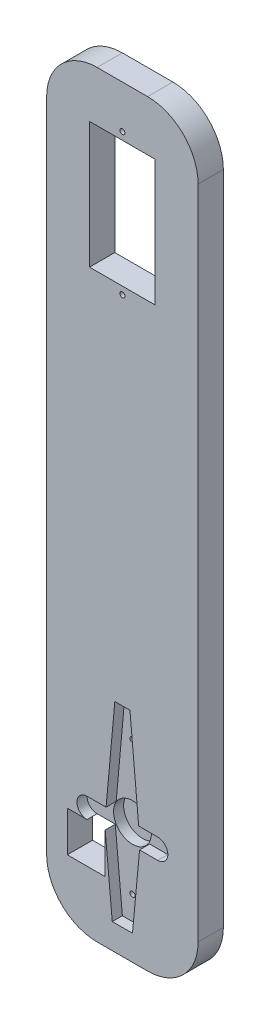
ISO-10303-21;
HEADER;
FILE_DESCRIPTION(('STEP AP214'),'2;1');
FILE_NAME('part.step','',(''),(''),'','','');
FILE_SCHEMA(('AUTOMOTIVE_DESIGN { 1 0 10303 214 1 1 1 1 }'));
ENDSEC;
DATA;
#1=APPLICATION_CONTEXT('core data for automotive mechanical design processes');
#2=APPLICATION_PROTOCOL_DEFINITION('international standard','automotive_design',2000,#1);
#3=PRODUCT_CONTEXT('',#1,'mechanical');
#4=PRODUCT('Part','Part','',(#3));
#5=PRODUCT_RELATED_PRODUCT_CATEGORY('part','',(#4));
#6=PRODUCT_DEFINITION_FORMATION('','',#4);
#7=PRODUCT_DEFINITION_CONTEXT('part definition',#1,'design');
#8=PRODUCT_DEFINITION('design','',#6,#7);
#9=PRODUCT_DEFINITION_SHAPE('','',#8);
#10=(LENGTH_UNIT() NAMED_UNIT(*) SI_UNIT(.MILLI.,.METRE.));
#11=(NAMED_UNIT(*) PLANE_ANGLE_UNIT() SI_UNIT($,.RADIAN.));
#12=(NAMED_UNIT(*) SI_UNIT($,.STERADIAN.) SOLID_ANGLE_UNIT());
#13=UNCERTAINTY_MEASURE_WITH_UNIT(LENGTH_MEASURE(1.E-05),#10,'distance_accuracy_value','');
#14=(GEOMETRIC_REPRESENTATION_CONTEXT(3) GLOBAL_UNCERTAINTY_ASSIGNED_CONTEXT((#13)) GLOBAL_UNIT_ASSIGNED_CONTEXT((#10,
#11,#12)) REPRESENTATION_CONTEXT('',''));
#15=CARTESIAN_POINT('',(0.,0.,0.));
#16=DIRECTION('',(0.,0.,1.));
#17=DIRECTION('',(1.,0.,0.));
#18=AXIS2_PLACEMENT_3D('',#15,#16,#17);
#19=CARTESIAN_POINT('',(0.,0.,5.));
#20=DIRECTION('',(0.,0.,-1.));
#21=DIRECTION('',(-1.,0.,0.));
#22=AXIS2_PLACEMENT_3D('',#19,#20,#21);
#23=PLANE('',#22);
#24=DIRECTION('',(1.,0.,0.));
#25=VECTOR('',#24,1.);
#26=CARTESIAN_POINT('',(0.,0.,5.));
#27=LINE('',#26,#25);
#28=CARTESIAN_POINT('',(10.,0.,5.));
#29=VERTEX_POINT('',#28);
#30=CARTESIAN_POINT('',(20.,0.,5.));
#31=VERTEX_POINT('',#30);
#32=EDGE_CURVE('E410',#29,#31,#27,.T.);
#33=ORIENTED_EDGE('',*,*,#32,.T.);
#34=CARTESIAN_POINT('',(20.,10.,5.));
#35=DIRECTION('',(0.,0.,-1.));
#36=DIRECTION('',(-1.,0.,0.));
#37=AXIS2_PLACEMENT_3D('',#34,#35,#36);
#38=CIRCLE('',#37,10.);
#39=CARTESIAN_POINT('',(30.,10.,5.));
#40=VERTEX_POINT('',#39);
#41=EDGE_CURVE('E454',#31,#40,#38,.F.);
#42=ORIENTED_EDGE('',*,*,#41,.T.);
#43=DIRECTION('',(0.,1.,0.));
#44=VECTOR('',#43,1.);
#45=CARTESIAN_POINT('',(30.,0.,5.));
#46=LINE('',#45,#44);
#47=CARTESIAN_POINT('',(30.,140.,5.));
#48=VERTEX_POINT('',#47);
#49=EDGE_CURVE('E414',#40,#48,#46,.T.);
#50=ORIENTED_EDGE('',*,*,#49,.T.);
#51=CARTESIAN_POINT('',(20.,140.,5.));
#52=DIRECTION('',(0.,0.,-1.));
#53=DIRECTION('',(-1.,0.,0.));
#54=AXIS2_PLACEMENT_3D('',#51,#52,#53);
#55=CIRCLE('',#54,10.);
#56=CARTESIAN_POINT('',(20.,150.,5.));
#57=VERTEX_POINT('',#56);
#58=EDGE_CURVE('E450',#48,#57,#55,.F.);
#59=ORIENTED_EDGE('',*,*,#58,.T.);
#60=DIRECTION('',(-1.,0.,0.));
#61=VECTOR('',#60,1.);
#62=CARTESIAN_POINT('',(0.,150.,5.));
#63=LINE('',#62,#61);
#64=CARTESIAN_POINT('',(10.,150.,5.));
#65=VERTEX_POINT('',#64);
#66=EDGE_CURVE('E417',#57,#65,#63,.T.);
#67=ORIENTED_EDGE('',*,*,#66,.T.);
#68=CARTESIAN_POINT('',(10.,140.,5.));
#69=DIRECTION('',(0.,0.,-1.));
#70=DIRECTION('',(-1.,0.,0.));
#71=AXIS2_PLACEMENT_3D('',#68,#69,#70);
#72=CIRCLE('',#71,10.);
#73=CARTESIAN_POINT('',(0.,140.,5.));
#74=VERTEX_POINT('',#73);
#75=EDGE_CURVE('E448',#65,#74,#72,.F.);
#76=ORIENTED_EDGE('',*,*,#75,.T.);
#77=DIRECTION('',(0.,-1.,0.));
#78=VECTOR('',#77,1.);
#79=CARTESIAN_POINT('',(0.,0.,5.));
#80=LINE('',#79,#78);
#81=CARTESIAN_POINT('',(0.,10.,5.));
#82=VERTEX_POINT('',#81);
#83=EDGE_CURVE('E407',#74,#82,#80,.T.);
#84=ORIENTED_EDGE('',*,*,#83,.T.);
#85=CARTESIAN_POINT('',(10.,10.,5.));
#86=DIRECTION('',(0.,0.,-1.));
#87=DIRECTION('',(-1.,0.,0.));
#88=AXIS2_PLACEMENT_3D('',#85,#86,#87);
#89=CIRCLE('',#88,10.);
#90=EDGE_CURVE('E452',#82,#29,#89,.F.);
#91=ORIENTED_EDGE('',*,*,#90,.T.);
#92=EDGE_LOOP('',(#33,#42,#50,#59,#67,#76,#84,#91));
#93=FACE_BOUND('',#92,.T.);
#94=DIRECTION('',(1.,0.,0.));
#95=VECTOR('',#94,1.);
#96=CARTESIAN_POINT('',(8.5,115.,5.));
#97=LINE('',#96,#95);
#98=CARTESIAN_POINT('',(8.5,115.,5.));
#99=VERTEX_POINT('',#98);
#100=CARTESIAN_POINT('',(21.5,115.,5.));
#101=VERTEX_POINT('',#100);
#102=EDGE_CURVE('E390',#99,#101,#97,.T.);
#103=ORIENTED_EDGE('',*,*,#102,.F.);
#104=DIRECTION('',(0.,-1.,0.));
#105=VECTOR('',#104,1.);
#106=CARTESIAN_POINT('',(8.5,140.,5.));
#107=LINE('',#106,#105);
#108=CARTESIAN_POINT('',(8.5,140.,5.));
#109=VERTEX_POINT('',#108);
#110=EDGE_CURVE('E366',#109,#99,#107,.T.);
#111=ORIENTED_EDGE('',*,*,#110,.F.);
#112=DIRECTION('',(-1.,0.,0.));
#113=VECTOR('',#112,1.);
#114=CARTESIAN_POINT('',(8.5,140.,5.));
#115=LINE('',#114,#113);
#116=CARTESIAN_POINT('',(21.5,140.,5.));
#117=VERTEX_POINT('',#116);
#118=EDGE_CURVE('E379',#117,#109,#115,.T.);
#119=ORIENTED_EDGE('',*,*,#118,.F.);
#120=DIRECTION('',(0.,1.,0.));
#121=VECTOR('',#120,1.);
#122=CARTESIAN_POINT('',(21.5,140.,5.));
#123=LINE('',#122,#121);
#124=EDGE_CURVE('E393',#101,#117,#123,.T.);
#125=ORIENTED_EDGE('',*,*,#124,.F.);
#126=EDGE_LOOP('',(#103,#111,#119,#125));
#127=FACE_BOUND('',#126,.T.);
#128=CARTESIAN_POINT('',(15.,113.5,5.));
#129=DIRECTION('',(0.,0.,1.));
#130=DIRECTION('',(-1.,0.,0.));
#131=AXIS2_PLACEMENT_3D('',#128,#129,#130);
#132=CIRCLE('',#131,0.500000000000001);
#133=CARTESIAN_POINT('',(14.5,113.5,5.));
#134=VERTEX_POINT('',#133);
#135=EDGE_CURVE('E342',#134,#134,#132,.T.);
#136=ORIENTED_EDGE('',*,*,#135,.F.);
#137=EDGE_LOOP('',(#136));
#138=FACE_BOUND('',#137,.T.);
#139=CARTESIAN_POINT('',(15.,141.5,5.));
#140=DIRECTION('',(0.,0.,1.));
#141=DIRECTION('',(1.,0.,0.));
#142=AXIS2_PLACEMENT_3D('',#139,#140,#141);
#143=CIRCLE('',#142,0.500000000000001);
#144=CARTESIAN_POINT('',(15.5,141.5,5.));
#145=VERTEX_POINT('',#144);
#146=EDGE_CURVE('E367',#145,#145,#143,.T.);
#147=ORIENTED_EDGE('',*,*,#146,.F.);
#148=EDGE_LOOP('',(#147));
#149=FACE_BOUND('',#148,.T.);
#150=DIRECTION('',(0.0933407086930581,-0.995634226059288,0.));
#151=VECTOR('',#150,1.);
#152=CARTESIAN_POINT('',(13.351403678606,1.25169409486931,5.));
#153=LINE('',#152,#151);
#154=CARTESIAN_POINT('',(11.59375,20.,5.));
#155=VERTEX_POINT('',#154);
#156=CARTESIAN_POINT('',(13.,5.,5.));
#157=VERTEX_POINT('',#156);
#158=EDGE_CURVE('E326',#155,#157,#153,.T.);
#159=ORIENTED_EDGE('',*,*,#158,.F.);
#160=DIRECTION('',(0.,1.,0.));
#161=VECTOR('',#160,1.);
#162=CARTESIAN_POINT('',(11.59375,20.,5.));
#163=LINE('',#162,#161);
#164=CARTESIAN_POINT('',(11.59375,12.,5.));
#165=VERTEX_POINT('',#164);
#166=EDGE_CURVE('E246',#165,#155,#163,.T.);
#167=ORIENTED_EDGE('',*,*,#166,.F.);
#168=DIRECTION('',(1.,0.,0.));
#169=VECTOR('',#168,1.);
#170=CARTESIAN_POINT('',(11.59375,12.,5.));
#171=LINE('',#170,#169);
#172=CARTESIAN_POINT('',(4.09375,12.,5.));
#173=VERTEX_POINT('',#172);
#174=EDGE_CURVE('E238',#173,#165,#171,.T.);
#175=ORIENTED_EDGE('',*,*,#174,.F.);
#176=DIRECTION('',(0.,-1.,0.));
#177=VECTOR('',#176,1.);
#178=CARTESIAN_POINT('',(4.09375,20.,5.));
#179=LINE('',#178,#177);
#180=CARTESIAN_POINT('',(4.09375,20.,5.));
#181=VERTEX_POINT('',#180);
#182=EDGE_CURVE('E241',#181,#173,#179,.T.);
#183=ORIENTED_EDGE('',*,*,#182,.F.);
#184=DIRECTION('',(-1.,0.,0.));
#185=VECTOR('',#184,1.);
#186=CARTESIAN_POINT('',(11.59375,20.,5.));
#187=LINE('',#186,#185);
#188=CARTESIAN_POINT('',(8.,20.,5.));
#189=VERTEX_POINT('',#188);
#190=EDGE_CURVE('E248',#189,#181,#187,.T.);
#191=ORIENTED_EDGE('',*,*,#190,.F.);
#192=CARTESIAN_POINT('',(8.,22.,5.));
#193=DIRECTION('',(0.,0.,1.));
#194=DIRECTION('',(1.,0.,0.));
#195=AXIS2_PLACEMENT_3D('',#192,#193,#194);
#196=CIRCLE('',#195,2.);
#197=CARTESIAN_POINT('',(8.,24.,5.));
#198=VERTEX_POINT('',#197);
#199=EDGE_CURVE('E323',#198,#189,#196,.T.);
#200=ORIENTED_EDGE('',*,*,#199,.F.);
#201=DIRECTION('',(1.,0.,0.));
#202=VECTOR('',#201,1.);
#203=CARTESIAN_POINT('',(0.,24.,5.));
#204=LINE('',#203,#202);
#205=CARTESIAN_POINT('',(11.7727272727273,24.,5.));
#206=VERTEX_POINT('',#205);
#207=EDGE_CURVE('E320',#198,#206,#204,.T.);
#208=ORIENTED_EDGE('',*,*,#207,.T.);
#209=DIRECTION('',(-0.0905357460425186,-0.995893206467704,0.));
#210=VECTOR('',#209,1.);
#211=CARTESIAN_POINT('',(9.51229508196721,-0.864754098360656,5.));
#212=LINE('',#211,#210);
#213=CARTESIAN_POINT('',(13.5,43.,5.));
#214=VERTEX_POINT('',#213);
#215=EDGE_CURVE('E317',#214,#206,#212,.T.);
#216=ORIENTED_EDGE('',*,*,#215,.F.);
#217=DIRECTION('',(1.,0.,0.));
#218=VECTOR('',#217,1.);
#219=CARTESIAN_POINT('',(0.,43.,5.));
#220=LINE('',#219,#218);
#221=CARTESIAN_POINT('',(16.5,43.,5.));
#222=VERTEX_POINT('',#221);
#223=EDGE_CURVE('E314',#214,#222,#220,.T.);
#224=ORIENTED_EDGE('',*,*,#223,.T.);
#225=DIRECTION('',(-0.0905357460425185,0.995893206467704,0.));
#226=VECTOR('',#225,1.);
#227=CARTESIAN_POINT('',(20.2418032786885,1.84016393442623,5.));
#228=LINE('',#227,#226);
#229=CARTESIAN_POINT('',(18.2272727272727,24.,5.));
#230=VERTEX_POINT('',#229);
#231=EDGE_CURVE('E311',#230,#222,#228,.T.);
#232=ORIENTED_EDGE('',*,*,#231,.F.);
#233=DIRECTION('',(1.,0.,0.));
#234=VECTOR('',#233,1.);
#235=CARTESIAN_POINT('',(0.,24.,5.));
#236=LINE('',#235,#234);
#237=CARTESIAN_POINT('',(22.,24.,5.));
#238=VERTEX_POINT('',#237);
#239=EDGE_CURVE('E56',#230,#238,#236,.T.);
#240=ORIENTED_EDGE('',*,*,#239,.T.);
#241=CARTESIAN_POINT('',(22.,22.,5.));
#242=DIRECTION('',(0.,0.,1.));
#243=DIRECTION('',(1.,0.,0.));
#244=AXIS2_PLACEMENT_3D('',#241,#242,#243);
#245=CIRCLE('',#244,2.);
#246=CARTESIAN_POINT('',(22.,20.,5.));
#247=VERTEX_POINT('',#246);
#248=EDGE_CURVE('E279',#238,#247,#245,.F.);
#249=ORIENTED_EDGE('',*,*,#248,.T.);
#250=DIRECTION('',(1.,0.,0.));
#251=VECTOR('',#250,1.);
#252=CARTESIAN_POINT('',(0.,20.,5.));
#253=LINE('',#252,#251);
#254=CARTESIAN_POINT('',(18.40625,20.,5.));
#255=VERTEX_POINT('',#254);
#256=EDGE_CURVE('E335',#255,#247,#253,.T.);
#257=ORIENTED_EDGE('',*,*,#256,.F.);
#258=DIRECTION('',(0.0933407086930581,0.995634226059288,0.));
#259=VECTOR('',#258,1.);
#260=CARTESIAN_POINT('',(16.3872216844143,-1.53630203291384,5.));
#261=LINE('',#260,#259);
#262=CARTESIAN_POINT('',(17.,5.,5.));
#263=VERTEX_POINT('',#262);
#264=EDGE_CURVE('E332',#263,#255,#261,.T.);
#265=ORIENTED_EDGE('',*,*,#264,.F.);
#266=DIRECTION('',(1.,0.,0.));
#267=VECTOR('',#266,1.);
#268=CARTESIAN_POINT('',(0.,5.,5.));
#269=LINE('',#268,#267);
#270=EDGE_CURVE('E329',#157,#263,#269,.T.);
#271=ORIENTED_EDGE('',*,*,#270,.F.);
#272=EDGE_LOOP('',(#159,#167,#175,#183,#191,#200,#208,#216,#224,#232,#240,#249,#257,#265,#271));
#273=FACE_BOUND('',#272,.T.);
#274=ADVANCED_FACE('F33',(#93,#127,#138,#149,#273),#23,.F.);
#275=CARTESIAN_POINT('',(0.,0.,5.));
#276=DIRECTION('',(1.,0.,0.));
#277=DIRECTION('',(0.,0.,-1.));
#278=AXIS2_PLACEMENT_3D('',#275,#276,#277);
#279=PLANE('',#278);
#280=DIRECTION('',(0.,-1.,0.));
#281=VECTOR('',#280,1.);
#282=CARTESIAN_POINT('',(0.,0.,0.));
#283=LINE('',#282,#281);
#284=CARTESIAN_POINT('',(0.,140.,0.));
#285=VERTEX_POINT('',#284);
#286=CARTESIAN_POINT('',(0.,10.,0.));
#287=VERTEX_POINT('',#286);
#288=EDGE_CURVE('E400',#285,#287,#283,.T.);
#289=ORIENTED_EDGE('',*,*,#288,.T.);
#290=DIRECTION('',(0.,0.,-1.));
#291=VECTOR('',#290,1.);
#292=CARTESIAN_POINT('',(0.,10.,5.));
#293=LINE('',#292,#291);
#294=EDGE_CURVE('E459',#287,#82,#293,.F.);
#295=ORIENTED_EDGE('',*,*,#294,.T.);
#296=ORIENTED_EDGE('',*,*,#83,.F.);
#297=DIRECTION('',(0.,0.,-1.));
#298=VECTOR('',#297,1.);
#299=CARTESIAN_POINT('',(0.,140.,5.));
#300=LINE('',#299,#298);
#301=EDGE_CURVE('E456',#74,#285,#300,.T.);
#302=ORIENTED_EDGE('',*,*,#301,.T.);
#303=EDGE_LOOP('',(#289,#295,#296,#302));
#304=FACE_BOUND('',#303,.T.);
#305=ADVANCED_FACE('F475',(#304),#279,.F.);
#306=CARTESIAN_POINT('',(0.,0.,5.));
#307=DIRECTION('',(0.,1.,0.));
#308=DIRECTION('',(0.,0.,1.));
#309=AXIS2_PLACEMENT_3D('',#306,#307,#308);
#310=PLANE('',#309);
#311=DIRECTION('',(1.,0.,0.));
#312=VECTOR('',#311,1.);
#313=CARTESIAN_POINT('',(0.,0.,0.));
#314=LINE('',#313,#312);
#315=CARTESIAN_POINT('',(10.,0.,0.));
#316=VERTEX_POINT('',#315);
#317=CARTESIAN_POINT('',(20.,0.,0.));
#318=VERTEX_POINT('',#317);
#319=EDGE_CURVE('E423',#316,#318,#314,.T.);
#320=ORIENTED_EDGE('',*,*,#319,.T.);
#321=DIRECTION('',(0.,0.,-1.));
#322=VECTOR('',#321,1.);
#323=CARTESIAN_POINT('',(20.,0.,5.));
#324=LINE('',#323,#322);
#325=EDGE_CURVE('E446',#318,#31,#324,.F.);
#326=ORIENTED_EDGE('',*,*,#325,.T.);
#327=ORIENTED_EDGE('',*,*,#32,.F.);
#328=DIRECTION('',(0.,0.,-1.));
#329=VECTOR('',#328,1.);
#330=CARTESIAN_POINT('',(10.,0.,5.));
#331=LINE('',#330,#329);
#332=EDGE_CURVE('E443',#29,#316,#331,.T.);
#333=ORIENTED_EDGE('',*,*,#332,.T.);
#334=EDGE_LOOP('',(#320,#326,#327,#333));
#335=FACE_BOUND('',#334,.T.);
#336=ADVANCED_FACE('F486',(#335),#310,.F.);
#337=CARTESIAN_POINT('',(30.,0.,5.));
#338=DIRECTION('',(-1.,0.,0.));
#339=DIRECTION('',(0.,0.,1.));
#340=AXIS2_PLACEMENT_3D('',#337,#338,#339);
#341=PLANE('',#340);
#342=ORIENTED_EDGE('',*,*,#49,.F.);
#343=DIRECTION('',(0.,0.,-1.));
#344=VECTOR('',#343,1.);
#345=CARTESIAN_POINT('',(30.,10.,5.));
#346=LINE('',#345,#344);
#347=CARTESIAN_POINT('',(30.,10.,0.));
#348=VERTEX_POINT('',#347);
#349=EDGE_CURVE('E432',#40,#348,#346,.T.);
#350=ORIENTED_EDGE('',*,*,#349,.T.);
#351=DIRECTION('',(0.,1.,0.));
#352=VECTOR('',#351,1.);
#353=CARTESIAN_POINT('',(30.,0.,0.));
#354=LINE('',#353,#352);
#355=CARTESIAN_POINT('',(30.,140.,0.));
#356=VERTEX_POINT('',#355);
#357=EDGE_CURVE('E426',#348,#356,#354,.T.);
#358=ORIENTED_EDGE('',*,*,#357,.T.);
#359=DIRECTION('',(0.,0.,-1.));
#360=VECTOR('',#359,1.);
#361=CARTESIAN_POINT('',(30.,140.,5.));
#362=LINE('',#361,#360);
#363=EDGE_CURVE('E420',#356,#48,#362,.F.);
#364=ORIENTED_EDGE('',*,*,#363,.T.);
#365=EDGE_LOOP('',(#342,#350,#358,#364));
#366=FACE_BOUND('',#365,.T.);
#367=ADVANCED_FACE('F494',(#366),#341,.F.);
#368=CARTESIAN_POINT('',(0.,150.,5.));
#369=DIRECTION('',(0.,-1.,0.));
#370=DIRECTION('',(0.,0.,-1.));
#371=AXIS2_PLACEMENT_3D('',#368,#369,#370);
#372=PLANE('',#371);
#373=ORIENTED_EDGE('',*,*,#66,.F.);
#374=DIRECTION('',(0.,0.,-1.));
#375=VECTOR('',#374,1.);
#376=CARTESIAN_POINT('',(20.,150.,5.));
#377=LINE('',#376,#375);
#378=CARTESIAN_POINT('',(20.,150.,0.));
#379=VERTEX_POINT('',#378);
#380=EDGE_CURVE('E11',#57,#379,#377,.T.);
#381=ORIENTED_EDGE('',*,*,#380,.T.);
#382=DIRECTION('',(-1.,0.,0.));
#383=VECTOR('',#382,1.);
#384=CARTESIAN_POINT('',(0.,150.,0.));
#385=LINE('',#384,#383);
#386=CARTESIAN_POINT('',(10.,150.,0.));
#387=VERTEX_POINT('',#386);
#388=EDGE_CURVE('E411',#379,#387,#385,.T.);
#389=ORIENTED_EDGE('',*,*,#388,.T.);
#390=DIRECTION('',(0.,0.,-1.));
#391=VECTOR('',#390,1.);
#392=CARTESIAN_POINT('',(10.,150.,5.));
#393=LINE('',#392,#391);
#394=EDGE_CURVE('E41',#387,#65,#393,.F.);
#395=ORIENTED_EDGE('',*,*,#394,.T.);
#396=EDGE_LOOP('',(#373,#381,#389,#395));
#397=FACE_BOUND('',#396,.T.);
#398=ADVANCED_FACE('F463',(#397),#372,.F.);
#399=CARTESIAN_POINT('',(0.,0.,0.));
#400=DIRECTION('',(0.,0.,-1.));
#401=DIRECTION('',(-1.,0.,0.));
#402=AXIS2_PLACEMENT_3D('',#399,#400,#401);
#403=PLANE('',#402);
#404=DIRECTION('',(0.,1.,0.));
#405=VECTOR('',#404,1.);
#406=CARTESIAN_POINT('',(11.59375,20.,0.));
#407=LINE('',#406,#405);
#408=CARTESIAN_POINT('',(11.59375,12.,0.));
#409=VERTEX_POINT('',#408);
#410=CARTESIAN_POINT('',(11.59375,20.,0.));
#411=VERTEX_POINT('',#410);
#412=EDGE_CURVE('E221',#409,#411,#407,.T.);
#413=ORIENTED_EDGE('',*,*,#412,.T.);
#414=DIRECTION('',(-1.,0.,0.));
#415=VECTOR('',#414,1.);
#416=CARTESIAN_POINT('',(11.59375,20.,0.));
#417=LINE('',#416,#415);
#418=CARTESIAN_POINT('',(4.09375,20.,0.));
#419=VERTEX_POINT('',#418);
#420=EDGE_CURVE('E231',#411,#419,#417,.T.);
#421=ORIENTED_EDGE('',*,*,#420,.T.);
#422=DIRECTION('',(0.,-1.,0.));
#423=VECTOR('',#422,1.);
#424=CARTESIAN_POINT('',(4.09375,20.,0.));
#425=LINE('',#424,#423);
#426=CARTESIAN_POINT('',(4.09375,12.,0.));
#427=VERTEX_POINT('',#426);
#428=EDGE_CURVE('E48',#419,#427,#425,.T.);
#429=ORIENTED_EDGE('',*,*,#428,.T.);
#430=DIRECTION('',(1.,0.,0.));
#431=VECTOR('',#430,1.);
#432=CARTESIAN_POINT('',(11.59375,12.,0.));
#433=LINE('',#432,#431);
#434=EDGE_CURVE('E228',#427,#409,#433,.T.);
#435=ORIENTED_EDGE('',*,*,#434,.T.);
#436=EDGE_LOOP('',(#413,#421,#429,#435));
#437=FACE_BOUND('',#436,.T.);
#438=CARTESIAN_POINT('',(15.,36.2,0.));
#439=DIRECTION('',(0.,0.,1.));
#440=DIRECTION('',(1.,0.,0.));
#441=AXIS2_PLACEMENT_3D('',#438,#439,#440);
#442=CIRCLE('',#441,0.500000000000001);
#443=CARTESIAN_POINT('',(15.5,36.2,0.));
#444=VERTEX_POINT('',#443);
#445=EDGE_CURVE('E264',#444,#444,#442,.T.);
#446=ORIENTED_EDGE('',*,*,#445,.T.);
#447=EDGE_LOOP('',(#446));
#448=FACE_BOUND('',#447,.T.);
#449=CARTESIAN_POINT('',(15.,9.69999999999999,0.));
#450=DIRECTION('',(0.,0.,1.));
#451=DIRECTION('',(1.,0.,0.));
#452=AXIS2_PLACEMENT_3D('',#449,#450,#451);
#453=CIRCLE('',#452,0.500000000000001);
#454=CARTESIAN_POINT('',(15.5,9.69999999999999,0.));
#455=VERTEX_POINT('',#454);
#456=EDGE_CURVE('E270',#455,#455,#453,.T.);
#457=ORIENTED_EDGE('',*,*,#456,.T.);
#458=EDGE_LOOP('',(#457));
#459=FACE_BOUND('',#458,.T.);
#460=CARTESIAN_POINT('',(15.,141.5,0.));
#461=DIRECTION('',(0.,0.,1.));
#462=DIRECTION('',(1.,0.,0.));
#463=AXIS2_PLACEMENT_3D('',#460,#461,#462);
#464=CIRCLE('',#463,0.500000000000001);
#465=CARTESIAN_POINT('',(15.5,141.5,0.));
#466=VERTEX_POINT('',#465);
#467=EDGE_CURVE('E363',#466,#466,#464,.T.);
#468=ORIENTED_EDGE('',*,*,#467,.T.);
#469=EDGE_LOOP('',(#468));
#470=FACE_BOUND('',#469,.T.);
#471=CARTESIAN_POINT('',(15.,113.5,0.));
#472=DIRECTION('',(0.,0.,1.));
#473=DIRECTION('',(-1.,0.,0.));
#474=AXIS2_PLACEMENT_3D('',#471,#472,#473);
#475=CIRCLE('',#474,0.500000000000001);
#476=CARTESIAN_POINT('',(14.5,113.5,0.));
#477=VERTEX_POINT('',#476);
#478=EDGE_CURVE('E370',#477,#477,#475,.T.);
#479=ORIENTED_EDGE('',*,*,#478,.T.);
#480=EDGE_LOOP('',(#479));
#481=FACE_BOUND('',#480,.T.);
#482=DIRECTION('',(0.,-1.,0.));
#483=VECTOR('',#482,1.);
#484=CARTESIAN_POINT('',(8.5,140.,0.));
#485=LINE('',#484,#483);
#486=CARTESIAN_POINT('',(8.5,140.,0.));
#487=VERTEX_POINT('',#486);
#488=CARTESIAN_POINT('',(8.5,115.,0.));
#489=VERTEX_POINT('',#488);
#490=EDGE_CURVE('E375',#487,#489,#485,.T.);
#491=ORIENTED_EDGE('',*,*,#490,.T.);
#492=DIRECTION('',(1.,0.,0.));
#493=VECTOR('',#492,1.);
#494=CARTESIAN_POINT('',(8.5,115.,0.));
#495=LINE('',#494,#493);
#496=CARTESIAN_POINT('',(21.5,115.,0.));
#497=VERTEX_POINT('',#496);
#498=EDGE_CURVE('E378',#489,#497,#495,.T.);
#499=ORIENTED_EDGE('',*,*,#498,.T.);
#500=DIRECTION('',(0.,1.,0.));
#501=VECTOR('',#500,1.);
#502=CARTESIAN_POINT('',(21.5,140.,0.));
#503=LINE('',#502,#501);
#504=CARTESIAN_POINT('',(21.5,140.,0.));
#505=VERTEX_POINT('',#504);
#506=EDGE_CURVE('E382',#497,#505,#503,.T.);
#507=ORIENTED_EDGE('',*,*,#506,.T.);
#508=DIRECTION('',(-1.,0.,0.));
#509=VECTOR('',#508,1.);
#510=CARTESIAN_POINT('',(8.5,140.,0.));
#511=LINE('',#510,#509);
#512=EDGE_CURVE('E385',#505,#487,#511,.T.);
#513=ORIENTED_EDGE('',*,*,#512,.T.);
#514=EDGE_LOOP('',(#491,#499,#507,#513));
#515=FACE_BOUND('',#514,.T.);
#516=ORIENTED_EDGE('',*,*,#357,.F.);
#517=CARTESIAN_POINT('',(20.,10.,0.));
#518=DIRECTION('',(0.,0.,-1.));
#519=DIRECTION('',(-1.,0.,0.));
#520=AXIS2_PLACEMENT_3D('',#517,#518,#519);
#521=CIRCLE('',#520,10.);
#522=EDGE_CURVE('E441',#348,#318,#521,.T.);
#523=ORIENTED_EDGE('',*,*,#522,.T.);
#524=ORIENTED_EDGE('',*,*,#319,.F.);
#525=CARTESIAN_POINT('',(10.,10.,0.));
#526=DIRECTION('',(0.,0.,-1.));
#527=DIRECTION('',(-1.,0.,0.));
#528=AXIS2_PLACEMENT_3D('',#525,#526,#527);
#529=CIRCLE('',#528,10.);
#530=EDGE_CURVE('E439',#316,#287,#529,.T.);
#531=ORIENTED_EDGE('',*,*,#530,.T.);
#532=ORIENTED_EDGE('',*,*,#288,.F.);
#533=CARTESIAN_POINT('',(10.,140.,0.));
#534=DIRECTION('',(0.,0.,-1.));
#535=DIRECTION('',(-1.,0.,0.));
#536=AXIS2_PLACEMENT_3D('',#533,#534,#535);
#537=CIRCLE('',#536,10.);
#538=EDGE_CURVE('E435',#285,#387,#537,.T.);
#539=ORIENTED_EDGE('',*,*,#538,.T.);
#540=ORIENTED_EDGE('',*,*,#388,.F.);
#541=CARTESIAN_POINT('',(20.,140.,0.));
#542=DIRECTION('',(0.,0.,-1.));
#543=DIRECTION('',(-1.,0.,0.));
#544=AXIS2_PLACEMENT_3D('',#541,#542,#543);
#545=CIRCLE('',#544,10.);
#546=EDGE_CURVE('E437',#379,#356,#545,.T.);
#547=ORIENTED_EDGE('',*,*,#546,.T.);
#548=EDGE_LOOP('',(#516,#523,#524,#531,#532,#539,#540,#547));
#549=FACE_BOUND('',#548,.T.);
#550=ADVANCED_FACE('F235',(#437,#448,#459,#470,#481,#515,#549),#403,.T.);
#551=CARTESIAN_POINT('',(20.,10.,5.));
#552=DIRECTION('',(0.,0.,-1.));
#553=DIRECTION('',(-1.,0.,0.));
#554=AXIS2_PLACEMENT_3D('',#551,#552,#553);
#555=CYLINDRICAL_SURFACE('',#554,10.);
#556=ORIENTED_EDGE('',*,*,#41,.F.);
#557=ORIENTED_EDGE('',*,*,#325,.F.);
#558=ORIENTED_EDGE('',*,*,#522,.F.);
#559=ORIENTED_EDGE('',*,*,#349,.F.);
#560=EDGE_LOOP('',(#556,#557,#558,#559));
#561=FACE_BOUND('',#560,.T.);
#562=ADVANCED_FACE('F492',(#561),#555,.T.);
#563=CARTESIAN_POINT('',(10.,10.,5.));
#564=DIRECTION('',(0.,0.,-1.));
#565=DIRECTION('',(-1.,0.,0.));
#566=AXIS2_PLACEMENT_3D('',#563,#564,#565);
#567=CYLINDRICAL_SURFACE('',#566,10.);
#568=ORIENTED_EDGE('',*,*,#90,.F.);
#569=ORIENTED_EDGE('',*,*,#294,.F.);
#570=ORIENTED_EDGE('',*,*,#530,.F.);
#571=ORIENTED_EDGE('',*,*,#332,.F.);
#572=EDGE_LOOP('',(#568,#569,#570,#571));
#573=FACE_BOUND('',#572,.T.);
#574=ADVANCED_FACE('F483',(#573),#567,.T.);
#575=CARTESIAN_POINT('',(20.,140.,5.));
#576=DIRECTION('',(0.,0.,-1.));
#577=DIRECTION('',(-1.,0.,0.));
#578=AXIS2_PLACEMENT_3D('',#575,#576,#577);
#579=CYLINDRICAL_SURFACE('',#578,10.);
#580=ORIENTED_EDGE('',*,*,#58,.F.);
#581=ORIENTED_EDGE('',*,*,#363,.F.);
#582=ORIENTED_EDGE('',*,*,#546,.F.);
#583=ORIENTED_EDGE('',*,*,#380,.F.);
#584=EDGE_LOOP('',(#580,#581,#582,#583));
#585=FACE_BOUND('',#584,.T.);
#586=ADVANCED_FACE('F497',(#585),#579,.T.);
#587=CARTESIAN_POINT('',(10.,140.,5.));
#588=DIRECTION('',(0.,0.,-1.));
#589=DIRECTION('',(-1.,0.,0.));
#590=AXIS2_PLACEMENT_3D('',#587,#588,#589);
#591=CYLINDRICAL_SURFACE('',#590,10.);
#592=ORIENTED_EDGE('',*,*,#75,.F.);
#593=ORIENTED_EDGE('',*,*,#394,.F.);
#594=ORIENTED_EDGE('',*,*,#538,.F.);
#595=ORIENTED_EDGE('',*,*,#301,.F.);
#596=EDGE_LOOP('',(#592,#593,#594,#595));
#597=FACE_BOUND('',#596,.T.);
#598=ADVANCED_FACE('F35',(#597),#591,.T.);
#599=CARTESIAN_POINT('',(8.5,140.,0.));
#600=DIRECTION('',(-1.,0.,0.));
#601=DIRECTION('',(0.,-1.,0.));
#602=AXIS2_PLACEMENT_3D('',#599,#600,#601);
#603=PLANE('',#602);
#604=ORIENTED_EDGE('',*,*,#110,.T.);
#605=DIRECTION('',(0.,0.,1.));
#606=VECTOR('',#605,1.);
#607=CARTESIAN_POINT('',(8.5,115.,0.));
#608=LINE('',#607,#606);
#609=EDGE_CURVE('E388',#489,#99,#608,.T.);
#610=ORIENTED_EDGE('',*,*,#609,.F.);
#611=ORIENTED_EDGE('',*,*,#490,.F.);
#612=DIRECTION('',(0.,0.,1.));
#613=VECTOR('',#612,1.);
#614=CARTESIAN_POINT('',(8.5,140.,0.));
#615=LINE('',#614,#613);
#616=EDGE_CURVE('E398',#487,#109,#615,.T.);
#617=ORIENTED_EDGE('',*,*,#616,.T.);
#618=EDGE_LOOP('',(#604,#610,#611,#617));
#619=FACE_BOUND('',#618,.T.);
#620=ADVANCED_FACE('F503',(#619),#603,.F.);
#621=CARTESIAN_POINT('',(8.5,140.,0.));
#622=DIRECTION('',(0.,1.,0.));
#623=DIRECTION('',(0.,0.,1.));
#624=AXIS2_PLACEMENT_3D('',#621,#622,#623);
#625=PLANE('',#624);
#626=ORIENTED_EDGE('',*,*,#118,.T.);
#627=ORIENTED_EDGE('',*,*,#616,.F.);
#628=ORIENTED_EDGE('',*,*,#512,.F.);
#629=DIRECTION('',(0.,0.,1.));
#630=VECTOR('',#629,1.);
#631=CARTESIAN_POINT('',(21.5,140.,0.));
#632=LINE('',#631,#630);
#633=EDGE_CURVE('E401',#505,#117,#632,.T.);
#634=ORIENTED_EDGE('',*,*,#633,.T.);
#635=EDGE_LOOP('',(#626,#627,#628,#634));
#636=FACE_BOUND('',#635,.T.);
#637=ADVANCED_FACE('F551',(#636),#625,.F.);
#638=CARTESIAN_POINT('',(21.5,140.,0.));
#639=DIRECTION('',(1.,0.,0.));
#640=DIRECTION('',(0.,1.,0.));
#641=AXIS2_PLACEMENT_3D('',#638,#639,#640);
#642=PLANE('',#641);
#643=ORIENTED_EDGE('',*,*,#124,.T.);
#644=ORIENTED_EDGE('',*,*,#633,.F.);
#645=ORIENTED_EDGE('',*,*,#506,.F.);
#646=DIRECTION('',(0.,0.,1.));
#647=VECTOR('',#646,1.);
#648=CARTESIAN_POINT('',(21.5,115.,0.));
#649=LINE('',#648,#647);
#650=EDGE_CURVE('E403',#497,#101,#649,.T.);
#651=ORIENTED_EDGE('',*,*,#650,.T.);
#652=EDGE_LOOP('',(#643,#644,#645,#651));
#653=FACE_BOUND('',#652,.T.);
#654=ADVANCED_FACE('F560',(#653),#642,.F.);
#655=CARTESIAN_POINT('',(8.5,115.,0.));
#656=DIRECTION('',(0.,-1.,0.));
#657=DIRECTION('',(0.,0.,-1.));
#658=AXIS2_PLACEMENT_3D('',#655,#656,#657);
#659=PLANE('',#658);
#660=ORIENTED_EDGE('',*,*,#102,.T.);
#661=ORIENTED_EDGE('',*,*,#650,.F.);
#662=ORIENTED_EDGE('',*,*,#498,.F.);
#663=ORIENTED_EDGE('',*,*,#609,.T.);
#664=EDGE_LOOP('',(#660,#661,#662,#663));
#665=FACE_BOUND('',#664,.T.);
#666=ADVANCED_FACE('F570',(#665),#659,.F.);
#667=CARTESIAN_POINT('',(15.,113.5,0.));
#668=DIRECTION('',(0.,0.,1.));
#669=DIRECTION('',(1.,0.,0.));
#670=AXIS2_PLACEMENT_3D('',#667,#668,#669);
#671=CYLINDRICAL_SURFACE('',#670,0.500000000000001);
#672=ORIENTED_EDGE('',*,*,#478,.F.);
#673=EDGE_LOOP('',(#672));
#674=FACE_BOUND('',#673,.T.);
#675=ORIENTED_EDGE('',*,*,#135,.T.);
#676=EDGE_LOOP('',(#675));
#677=FACE_BOUND('',#676,.T.);
#678=ADVANCED_FACE('F580',(#674,#677),#671,.F.);
#679=CARTESIAN_POINT('',(15.,141.5,0.));
#680=DIRECTION('',(0.,0.,1.));
#681=DIRECTION('',(1.,0.,0.));
#682=AXIS2_PLACEMENT_3D('',#679,#680,#681);
#683=CYLINDRICAL_SURFACE('',#682,0.500000000000001);
#684=ORIENTED_EDGE('',*,*,#467,.F.);
#685=EDGE_LOOP('',(#684));
#686=FACE_BOUND('',#685,.T.);
#687=ORIENTED_EDGE('',*,*,#146,.T.);
#688=EDGE_LOOP('',(#687));
#689=FACE_BOUND('',#688,.T.);
#690=ADVANCED_FACE('F589',(#686,#689),#683,.F.);
#691=CARTESIAN_POINT('',(0.,24.,3.));
#692=DIRECTION('',(0.,-1.,0.));
#693=DIRECTION('',(0.,0.,-1.));
#694=AXIS2_PLACEMENT_3D('',#691,#692,#693);
#695=PLANE('',#694);
#696=ORIENTED_EDGE('',*,*,#239,.F.);
#697=DIRECTION('',(0.,0.,1.));
#698=VECTOR('',#697,1.);
#699=CARTESIAN_POINT('',(18.2272727272727,24.,3.));
#700=LINE('',#699,#698);
#701=CARTESIAN_POINT('',(18.2272727272727,24.,3.));
#702=VERTEX_POINT('',#701);
#703=EDGE_CURVE('E309',#702,#230,#700,.T.);
#704=ORIENTED_EDGE('',*,*,#703,.F.);
#705=DIRECTION('',(1.,0.,0.));
#706=VECTOR('',#705,1.);
#707=CARTESIAN_POINT('',(0.,24.,3.));
#708=LINE('',#707,#706);
#709=CARTESIAN_POINT('',(22.,24.,3.));
#710=VERTEX_POINT('',#709);
#711=EDGE_CURVE('E275',#702,#710,#708,.T.);
#712=ORIENTED_EDGE('',*,*,#711,.T.);
#713=DIRECTION('',(0.,0.,1.));
#714=VECTOR('',#713,1.);
#715=CARTESIAN_POINT('',(22.,24.,3.));
#716=LINE('',#715,#714);
#717=EDGE_CURVE('E340',#710,#238,#716,.T.);
#718=ORIENTED_EDGE('',*,*,#717,.T.);
#719=EDGE_LOOP('',(#696,#704,#712,#718));
#720=FACE_BOUND('',#719,.T.);
#721=ADVANCED_FACE('F599',(#720),#695,.T.);
#722=CARTESIAN_POINT('',(22.,22.,3.));
#723=DIRECTION('',(0.,0.,1.));
#724=DIRECTION('',(1.,0.,0.));
#725=AXIS2_PLACEMENT_3D('',#722,#723,#724);
#726=CYLINDRICAL_SURFACE('',#725,2.);
#727=ORIENTED_EDGE('',*,*,#248,.F.);
#728=ORIENTED_EDGE('',*,*,#717,.F.);
#729=CARTESIAN_POINT('',(22.,22.,3.));
#730=DIRECTION('',(0.,0.,1.));
#731=DIRECTION('',(1.,0.,0.));
#732=AXIS2_PLACEMENT_3D('',#729,#730,#731);
#733=CIRCLE('',#732,2.);
#734=CARTESIAN_POINT('',(22.,20.,3.));
#735=VERTEX_POINT('',#734);
#736=EDGE_CURVE('E307',#710,#735,#733,.F.);
#737=ORIENTED_EDGE('',*,*,#736,.T.);
#738=DIRECTION('',(0.,0.,1.));
#739=VECTOR('',#738,1.);
#740=CARTESIAN_POINT('',(22.,20.,3.));
#741=LINE('',#740,#739);
#742=EDGE_CURVE('E343',#735,#247,#741,.T.);
#743=ORIENTED_EDGE('',*,*,#742,.T.);
#744=EDGE_LOOP('',(#727,#728,#737,#743));
#745=FACE_BOUND('',#744,.T.);
#746=ADVANCED_FACE('F610',(#745),#726,.F.);
#747=CARTESIAN_POINT('',(0.,20.,3.));
#748=DIRECTION('',(0.,-1.,0.));
#749=DIRECTION('',(0.,0.,-1.));
#750=AXIS2_PLACEMENT_3D('',#747,#748,#749);
#751=PLANE('',#750);
#752=ORIENTED_EDGE('',*,*,#256,.T.);
#753=ORIENTED_EDGE('',*,*,#742,.F.);
#754=DIRECTION('',(1.,0.,0.));
#755=VECTOR('',#754,1.);
#756=CARTESIAN_POINT('',(0.,20.,3.));
#757=LINE('',#756,#755);
#758=CARTESIAN_POINT('',(18.40625,20.,3.));
#759=VERTEX_POINT('',#758);
#760=EDGE_CURVE('E304',#759,#735,#757,.T.);
#761=ORIENTED_EDGE('',*,*,#760,.F.);
#762=DIRECTION('',(0.,0.,1.));
#763=VECTOR('',#762,1.);
#764=CARTESIAN_POINT('',(18.40625,20.,3.));
#765=LINE('',#764,#763);
#766=EDGE_CURVE('E345',#759,#255,#765,.T.);
#767=ORIENTED_EDGE('',*,*,#766,.T.);
#768=EDGE_LOOP('',(#752,#753,#761,#767));
#769=FACE_BOUND('',#768,.T.);
#770=ADVANCED_FACE('F619',(#769),#751,.F.);
#771=CARTESIAN_POINT('',(16.3872216844143,-1.53630203291384,3.));
#772=DIRECTION('',(0.995634226059288,-0.0933407086930581,0.));
#773=DIRECTION('',(0.0933407086930581,0.995634226059288,0.));
#774=AXIS2_PLACEMENT_3D('',#771,#772,#773);
#775=PLANE('',#774);
#776=ORIENTED_EDGE('',*,*,#264,.T.);
#777=ORIENTED_EDGE('',*,*,#766,.F.);
#778=DIRECTION('',(0.0933407086930581,0.995634226059288,0.));
#779=VECTOR('',#778,1.);
#780=CARTESIAN_POINT('',(16.3872216844143,-1.53630203291384,3.));
#781=LINE('',#780,#779);
#782=CARTESIAN_POINT('',(17.,5.,3.));
#783=VERTEX_POINT('',#782);
#784=EDGE_CURVE('E301',#783,#759,#781,.T.);
#785=ORIENTED_EDGE('',*,*,#784,.F.);
#786=DIRECTION('',(0.,0.,1.));
#787=VECTOR('',#786,1.);
#788=CARTESIAN_POINT('',(17.,5.,3.));
#789=LINE('',#788,#787);
#790=EDGE_CURVE('E347',#783,#263,#789,.T.);
#791=ORIENTED_EDGE('',*,*,#790,.T.);
#792=EDGE_LOOP('',(#776,#777,#785,#791));
#793=FACE_BOUND('',#792,.T.);
#794=ADVANCED_FACE('F629',(#793),#775,.F.);
#795=CARTESIAN_POINT('',(0.,5.,3.));
#796=DIRECTION('',(0.,-1.,0.));
#797=DIRECTION('',(0.,0.,-1.));
#798=AXIS2_PLACEMENT_3D('',#795,#796,#797);
#799=PLANE('',#798);
#800=ORIENTED_EDGE('',*,*,#270,.T.);
#801=ORIENTED_EDGE('',*,*,#790,.F.);
#802=DIRECTION('',(1.,0.,0.));
#803=VECTOR('',#802,1.);
#804=CARTESIAN_POINT('',(0.,5.,3.));
#805=LINE('',#804,#803);
#806=CARTESIAN_POINT('',(13.,5.,3.));
#807=VERTEX_POINT('',#806);
#808=EDGE_CURVE('E298',#807,#783,#805,.T.);
#809=ORIENTED_EDGE('',*,*,#808,.F.);
#810=DIRECTION('',(0.,0.,1.));
#811=VECTOR('',#810,1.);
#812=CARTESIAN_POINT('',(13.,5.,3.));
#813=LINE('',#812,#811);
#814=EDGE_CURVE('E349',#807,#157,#813,.T.);
#815=ORIENTED_EDGE('',*,*,#814,.T.);
#816=EDGE_LOOP('',(#800,#801,#809,#815));
#817=FACE_BOUND('',#816,.T.);
#818=ADVANCED_FACE('F639',(#817),#799,.F.);
#819=CARTESIAN_POINT('',(13.351403678606,1.25169409486931,3.));
#820=DIRECTION('',(-0.995634226059288,-0.0933407086930581,0.));
#821=DIRECTION('',(0.0933407086930581,-0.995634226059288,0.));
#822=AXIS2_PLACEMENT_3D('',#819,#820,#821);
#823=PLANE('',#822);
#824=ORIENTED_EDGE('',*,*,#158,.T.);
#825=ORIENTED_EDGE('',*,*,#814,.F.);
#826=DIRECTION('',(0.0933407086930581,-0.995634226059288,0.));
#827=VECTOR('',#826,1.);
#828=CARTESIAN_POINT('',(13.351403678606,1.25169409486931,3.));
#829=LINE('',#828,#827);
#830=CARTESIAN_POINT('',(11.59375,20.,3.));
#831=VERTEX_POINT('',#830);
#832=EDGE_CURVE('E295',#831,#807,#829,.T.);
#833=ORIENTED_EDGE('',*,*,#832,.F.);
#834=DIRECTION('',(0.,0.,1.));
#835=VECTOR('',#834,1.);
#836=CARTESIAN_POINT('',(11.59375,20.,3.));
#837=LINE('',#836,#835);
#838=EDGE_CURVE('E224',#831,#155,#837,.T.);
#839=ORIENTED_EDGE('',*,*,#838,.T.);
#840=EDGE_LOOP('',(#824,#825,#833,#839));
#841=FACE_BOUND('',#840,.T.);
#842=ADVANCED_FACE('F649',(#841),#823,.F.);
#843=CARTESIAN_POINT('',(8.,22.,3.));
#844=DIRECTION('',(0.,0.,1.));
#845=DIRECTION('',(1.,0.,0.));
#846=AXIS2_PLACEMENT_3D('',#843,#844,#845);
#847=CYLINDRICAL_SURFACE('',#846,2.);
#848=ORIENTED_EDGE('',*,*,#199,.T.);
#849=DIRECTION('',(0.,0.,1.));
#850=VECTOR('',#849,1.);
#851=CARTESIAN_POINT('',(8.,20.,3.));
#852=LINE('',#851,#850);
#853=CARTESIAN_POINT('',(8.,20.,3.));
#854=VERTEX_POINT('',#853);
#855=EDGE_CURVE('E352',#854,#189,#852,.T.);
#856=ORIENTED_EDGE('',*,*,#855,.F.);
#857=CARTESIAN_POINT('',(8.,22.,3.));
#858=DIRECTION('',(0.,0.,1.));
#859=DIRECTION('',(1.,0.,0.));
#860=AXIS2_PLACEMENT_3D('',#857,#858,#859);
#861=CIRCLE('',#860,2.);
#862=CARTESIAN_POINT('',(8.,24.,3.));
#863=VERTEX_POINT('',#862);
#864=EDGE_CURVE('E289',#863,#854,#861,.T.);
#865=ORIENTED_EDGE('',*,*,#864,.F.);
#866=DIRECTION('',(0.,0.,1.));
#867=VECTOR('',#866,1.);
#868=CARTESIAN_POINT('',(8.,24.,3.));
#869=LINE('',#868,#867);
#870=EDGE_CURVE('E354',#863,#198,#869,.T.);
#871=ORIENTED_EDGE('',*,*,#870,.T.);
#872=EDGE_LOOP('',(#848,#856,#865,#871));
#873=FACE_BOUND('',#872,.T.);
#874=ADVANCED_FACE('F663',(#873),#847,.F.);
#875=CARTESIAN_POINT('',(0.,24.,3.));
#876=DIRECTION('',(0.,-1.,0.));
#877=DIRECTION('',(0.,0.,-1.));
#878=AXIS2_PLACEMENT_3D('',#875,#876,#877);
#879=PLANE('',#878);
#880=ORIENTED_EDGE('',*,*,#207,.F.);
#881=ORIENTED_EDGE('',*,*,#870,.F.);
#882=DIRECTION('',(1.,0.,0.));
#883=VECTOR('',#882,1.);
#884=CARTESIAN_POINT('',(0.,24.,3.));
#885=LINE('',#884,#883);
#886=CARTESIAN_POINT('',(11.7727272727273,24.,3.));
#887=VERTEX_POINT('',#886);
#888=EDGE_CURVE('E287',#863,#887,#885,.T.);
#889=ORIENTED_EDGE('',*,*,#888,.T.);
#890=DIRECTION('',(0.,0.,1.));
#891=VECTOR('',#890,1.);
#892=CARTESIAN_POINT('',(11.7727272727273,24.,3.));
#893=LINE('',#892,#891);
#894=EDGE_CURVE('E356',#887,#206,#893,.T.);
#895=ORIENTED_EDGE('',*,*,#894,.T.);
#896=EDGE_LOOP('',(#880,#881,#889,#895));
#897=FACE_BOUND('',#896,.T.);
#898=ADVANCED_FACE('F657',(#897),#879,.T.);
#899=CARTESIAN_POINT('',(9.51229508196721,-0.864754098360656,3.));
#900=DIRECTION('',(-0.995893206467704,0.0905357460425186,0.));
#901=DIRECTION('',(-0.0905357460425186,-0.995893206467704,0.));
#902=AXIS2_PLACEMENT_3D('',#899,#900,#901);
#903=PLANE('',#902);
#904=ORIENTED_EDGE('',*,*,#215,.T.);
#905=ORIENTED_EDGE('',*,*,#894,.F.);
#906=DIRECTION('',(-0.0905357460425186,-0.995893206467704,0.));
#907=VECTOR('',#906,1.);
#908=CARTESIAN_POINT('',(9.51229508196721,-0.864754098360656,3.));
#909=LINE('',#908,#907);
#910=CARTESIAN_POINT('',(13.5,43.,3.));
#911=VERTEX_POINT('',#910);
#912=EDGE_CURVE('E284',#911,#887,#909,.T.);
#913=ORIENTED_EDGE('',*,*,#912,.F.);
#914=DIRECTION('',(0.,0.,1.));
#915=VECTOR('',#914,1.);
#916=CARTESIAN_POINT('',(13.5,43.,3.));
#917=LINE('',#916,#915);
#918=EDGE_CURVE('E358',#911,#214,#917,.T.);
#919=ORIENTED_EDGE('',*,*,#918,.T.);
#920=EDGE_LOOP('',(#904,#905,#913,#919));
#921=FACE_BOUND('',#920,.T.);
#922=ADVANCED_FACE('F662',(#921),#903,.F.);
#923=CARTESIAN_POINT('',(0.,43.,3.));
#924=DIRECTION('',(0.,-1.,0.));
#925=DIRECTION('',(0.,0.,-1.));
#926=AXIS2_PLACEMENT_3D('',#923,#924,#925);
#927=PLANE('',#926);
#928=ORIENTED_EDGE('',*,*,#223,.F.);
#929=ORIENTED_EDGE('',*,*,#918,.F.);
#930=DIRECTION('',(1.,0.,0.));
#931=VECTOR('',#930,1.);
#932=CARTESIAN_POINT('',(0.,43.,3.));
#933=LINE('',#932,#931);
#934=CARTESIAN_POINT('',(16.5,43.,3.));
#935=VERTEX_POINT('',#934);
#936=EDGE_CURVE('E282',#911,#935,#933,.T.);
#937=ORIENTED_EDGE('',*,*,#936,.T.);
#938=DIRECTION('',(0.,0.,1.));
#939=VECTOR('',#938,1.);
#940=CARTESIAN_POINT('',(16.5,43.,3.));
#941=LINE('',#940,#939);
#942=EDGE_CURVE('E360',#935,#222,#941,.T.);
#943=ORIENTED_EDGE('',*,*,#942,.T.);
#944=EDGE_LOOP('',(#928,#929,#937,#943));
#945=FACE_BOUND('',#944,.T.);
#946=ADVANCED_FACE('F675',(#945),#927,.T.);
#947=CARTESIAN_POINT('',(20.2418032786885,1.84016393442623,3.));
#948=DIRECTION('',(0.995893206467704,0.0905357460425185,0.));
#949=DIRECTION('',(-0.0905357460425185,0.995893206467704,0.));
#950=AXIS2_PLACEMENT_3D('',#947,#948,#949);
#951=PLANE('',#950);
#952=ORIENTED_EDGE('',*,*,#231,.T.);
#953=ORIENTED_EDGE('',*,*,#942,.F.);
#954=DIRECTION('',(-0.0905357460425185,0.995893206467704,0.));
#955=VECTOR('',#954,1.);
#956=CARTESIAN_POINT('',(20.2418032786885,1.84016393442623,3.));
#957=LINE('',#956,#955);
#958=EDGE_CURVE('E278',#702,#935,#957,.T.);
#959=ORIENTED_EDGE('',*,*,#958,.F.);
#960=ORIENTED_EDGE('',*,*,#703,.T.);
#961=EDGE_LOOP('',(#952,#953,#959,#960));
#962=FACE_BOUND('',#961,.T.);
#963=ADVANCED_FACE('F685',(#962),#951,.F.);
#964=CARTESIAN_POINT('',(0.,0.,3.));
#965=DIRECTION('',(0.,0.,1.));
#966=DIRECTION('',(1.,0.,0.));
#967=AXIS2_PLACEMENT_3D('',#964,#965,#966);
#968=PLANE('',#967);
#969=CARTESIAN_POINT('',(15.,22.,3.));
#970=DIRECTION('',(0.,0.,1.));
#971=DIRECTION('',(1.,0.,0.));
#972=AXIS2_PLACEMENT_3D('',#969,#970,#971);
#973=CIRCLE('',#972,3.75);
#974=CARTESIAN_POINT('',(18.75,22.,3.));
#975=VERTEX_POINT('',#974);
#976=EDGE_CURVE('E254',#975,#975,#973,.T.);
#977=ORIENTED_EDGE('',*,*,#976,.F.);
#978=EDGE_LOOP('',(#977));
#979=FACE_BOUND('',#978,.T.);
#980=CARTESIAN_POINT('',(15.,36.2,3.));
#981=DIRECTION('',(0.,0.,1.));
#982=DIRECTION('',(1.,0.,0.));
#983=AXIS2_PLACEMENT_3D('',#980,#981,#982);
#984=CIRCLE('',#983,0.500000000000001);
#985=CARTESIAN_POINT('',(15.5,36.2,3.));
#986=VERTEX_POINT('',#985);
#987=EDGE_CURVE('E267',#986,#986,#984,.T.);
#988=ORIENTED_EDGE('',*,*,#987,.F.);
#989=EDGE_LOOP('',(#988));
#990=FACE_BOUND('',#989,.T.);
#991=CARTESIAN_POINT('',(15.,9.69999999999999,3.));
#992=DIRECTION('',(0.,0.,1.));
#993=DIRECTION('',(1.,0.,0.));
#994=AXIS2_PLACEMENT_3D('',#991,#992,#993);
#995=CIRCLE('',#994,0.500000000000001);
#996=CARTESIAN_POINT('',(15.5,9.69999999999999,3.));
#997=VERTEX_POINT('',#996);
#998=EDGE_CURVE('E261',#997,#997,#995,.T.);
#999=ORIENTED_EDGE('',*,*,#998,.F.);
#1000=EDGE_LOOP('',(#999));
#1001=FACE_BOUND('',#1000,.T.);
#1002=ORIENTED_EDGE('',*,*,#711,.F.);
#1003=ORIENTED_EDGE('',*,*,#958,.T.);
#1004=ORIENTED_EDGE('',*,*,#936,.F.);
#1005=ORIENTED_EDGE('',*,*,#912,.T.);
#1006=ORIENTED_EDGE('',*,*,#888,.F.);
#1007=ORIENTED_EDGE('',*,*,#864,.T.);
#1008=DIRECTION('',(1.,0.,0.));
#1009=VECTOR('',#1008,1.);
#1010=CARTESIAN_POINT('',(0.,20.,3.));
#1011=LINE('',#1010,#1009);
#1012=EDGE_CURVE('E292',#854,#831,#1011,.T.);
#1013=ORIENTED_EDGE('',*,*,#1012,.T.);
#1014=ORIENTED_EDGE('',*,*,#832,.T.);
#1015=ORIENTED_EDGE('',*,*,#808,.T.);
#1016=ORIENTED_EDGE('',*,*,#784,.T.);
#1017=ORIENTED_EDGE('',*,*,#760,.T.);
#1018=ORIENTED_EDGE('',*,*,#736,.F.);
#1019=EDGE_LOOP('',(#1002,#1003,#1004,#1005,#1006,#1007,#1013,#1014,#1015,#1016,#1017,#1018));
#1020=FACE_BOUND('',#1019,.T.);
#1021=ADVANCED_FACE('F695',(#979,#990,#1001,#1020),#968,.T.);
#1022=CARTESIAN_POINT('',(15.,9.69999999999999,0.));
#1023=DIRECTION('',(0.,0.,1.));
#1024=DIRECTION('',(1.,0.,0.));
#1025=AXIS2_PLACEMENT_3D('',#1022,#1023,#1024);
#1026=CYLINDRICAL_SURFACE('',#1025,0.500000000000001);
#1027=ORIENTED_EDGE('',*,*,#456,.F.);
#1028=EDGE_LOOP('',(#1027));
#1029=FACE_BOUND('',#1028,.T.);
#1030=ORIENTED_EDGE('',*,*,#998,.T.);
#1031=EDGE_LOOP('',(#1030));
#1032=FACE_BOUND('',#1031,.T.);
#1033=ADVANCED_FACE('F703',(#1029,#1032),#1026,.F.);
#1034=CARTESIAN_POINT('',(15.,36.2,0.));
#1035=DIRECTION('',(0.,0.,1.));
#1036=DIRECTION('',(1.,0.,0.));
#1037=AXIS2_PLACEMENT_3D('',#1034,#1035,#1036);
#1038=CYLINDRICAL_SURFACE('',#1037,0.500000000000001);
#1039=ORIENTED_EDGE('',*,*,#445,.F.);
#1040=EDGE_LOOP('',(#1039));
#1041=FACE_BOUND('',#1040,.T.);
#1042=ORIENTED_EDGE('',*,*,#987,.T.);
#1043=EDGE_LOOP('',(#1042));
#1044=FACE_BOUND('',#1043,.T.);
#1045=ADVANCED_FACE('F708',(#1041,#1044),#1038,.F.);
#1046=CARTESIAN_POINT('',(15.,22.,1.));
#1047=DIRECTION('',(0.,0.,1.));
#1048=DIRECTION('',(1.,0.,0.));
#1049=AXIS2_PLACEMENT_3D('',#1046,#1047,#1048);
#1050=CYLINDRICAL_SURFACE('',#1049,3.75);
#1051=CARTESIAN_POINT('',(15.,22.,1.));
#1052=DIRECTION('',(0.,0.,1.));
#1053=DIRECTION('',(1.,0.,0.));
#1054=AXIS2_PLACEMENT_3D('',#1051,#1052,#1053);
#1055=CIRCLE('',#1054,3.75);
#1056=CARTESIAN_POINT('',(18.75,22.,1.));
#1057=VERTEX_POINT('',#1056);
#1058=EDGE_CURVE('E258',#1057,#1057,#1055,.T.);
#1059=ORIENTED_EDGE('',*,*,#1058,.F.);
#1060=EDGE_LOOP('',(#1059));
#1061=FACE_BOUND('',#1060,.T.);
#1062=ORIENTED_EDGE('',*,*,#976,.T.);
#1063=EDGE_LOOP('',(#1062));
#1064=FACE_BOUND('',#1063,.T.);
#1065=ADVANCED_FACE('F719',(#1061,#1064),#1050,.F.);
#1066=CARTESIAN_POINT('',(15.,22.,1.));
#1067=DIRECTION('',(0.,0.,1.));
#1068=DIRECTION('',(1.,0.,0.));
#1069=AXIS2_PLACEMENT_3D('',#1066,#1067,#1068);
#1070=PLANE('',#1069);
#1071=ORIENTED_EDGE('',*,*,#1058,.T.);
#1072=EDGE_LOOP('',(#1071));
#1073=FACE_BOUND('',#1072,.T.);
#1074=ADVANCED_FACE('F729',(#1073),#1070,.T.);
#1075=CARTESIAN_POINT('',(11.59375,20.,0.));
#1076=DIRECTION('',(0.,1.,0.));
#1077=DIRECTION('',(0.,0.,1.));
#1078=AXIS2_PLACEMENT_3D('',#1075,#1076,#1077);
#1079=PLANE('',#1078);
#1080=ORIENTED_EDGE('',*,*,#190,.T.);
#1081=DIRECTION('',(0.,0.,1.));
#1082=VECTOR('',#1081,1.);
#1083=CARTESIAN_POINT('',(4.09375,20.,0.));
#1084=LINE('',#1083,#1082);
#1085=EDGE_CURVE('E227',#419,#181,#1084,.T.);
#1086=ORIENTED_EDGE('',*,*,#1085,.F.);
#1087=ORIENTED_EDGE('',*,*,#420,.F.);
#1088=DIRECTION('',(0.,0.,1.));
#1089=VECTOR('',#1088,1.);
#1090=CARTESIAN_POINT('',(11.59375,20.,0.));
#1091=LINE('',#1090,#1089);
#1092=EDGE_CURVE('E217',#411,#831,#1091,.T.);
#1093=ORIENTED_EDGE('',*,*,#1092,.T.);
#1094=ORIENTED_EDGE('',*,*,#1012,.F.);
#1095=ORIENTED_EDGE('',*,*,#855,.T.);
#1096=EDGE_LOOP('',(#1080,#1086,#1087,#1093,#1094,#1095));
#1097=FACE_BOUND('',#1096,.T.);
#1098=ADVANCED_FACE('F232',(#1097),#1079,.F.);
#1099=CARTESIAN_POINT('',(11.59375,20.,0.));
#1100=DIRECTION('',(1.,0.,0.));
#1101=DIRECTION('',(0.,1.,0.));
#1102=AXIS2_PLACEMENT_3D('',#1099,#1100,#1101);
#1103=PLANE('',#1102);
#1104=ORIENTED_EDGE('',*,*,#166,.T.);
#1105=ORIENTED_EDGE('',*,*,#838,.F.);
#1106=ORIENTED_EDGE('',*,*,#1092,.F.);
#1107=ORIENTED_EDGE('',*,*,#412,.F.);
#1108=DIRECTION('',(0.,0.,1.));
#1109=VECTOR('',#1108,1.);
#1110=CARTESIAN_POINT('',(11.59375,12.,0.));
#1111=LINE('',#1110,#1109);
#1112=EDGE_CURVE('E252',#409,#165,#1111,.T.);
#1113=ORIENTED_EDGE('',*,*,#1112,.T.);
#1114=EDGE_LOOP('',(#1104,#1105,#1106,#1107,#1113));
#1115=FACE_BOUND('',#1114,.T.);
#1116=ADVANCED_FACE('F219',(#1115),#1103,.F.);
#1117=CARTESIAN_POINT('',(11.59375,12.,0.));
#1118=DIRECTION('',(0.,-1.,0.));
#1119=DIRECTION('',(1.,0.,0.));
#1120=AXIS2_PLACEMENT_3D('',#1117,#1118,#1119);
#1121=PLANE('',#1120);
#1122=ORIENTED_EDGE('',*,*,#174,.T.);
#1123=ORIENTED_EDGE('',*,*,#1112,.F.);
#1124=ORIENTED_EDGE('',*,*,#434,.F.);
#1125=DIRECTION('',(0.,0.,1.));
#1126=VECTOR('',#1125,1.);
#1127=CARTESIAN_POINT('',(4.09375,12.,0.));
#1128=LINE('',#1127,#1126);
#1129=EDGE_CURVE('E255',#427,#173,#1128,.T.);
#1130=ORIENTED_EDGE('',*,*,#1129,.T.);
#1131=EDGE_LOOP('',(#1122,#1123,#1124,#1130));
#1132=FACE_BOUND('',#1131,.T.);
#1133=ADVANCED_FACE('F786',(#1132),#1121,.F.);
#1134=CARTESIAN_POINT('',(4.09375,20.,0.));
#1135=DIRECTION('',(-1.,0.,0.));
#1136=DIRECTION('',(0.,-1.,0.));
#1137=AXIS2_PLACEMENT_3D('',#1134,#1135,#1136);
#1138=PLANE('',#1137);
#1139=ORIENTED_EDGE('',*,*,#182,.T.);
#1140=ORIENTED_EDGE('',*,*,#1129,.F.);
#1141=ORIENTED_EDGE('',*,*,#428,.F.);
#1142=ORIENTED_EDGE('',*,*,#1085,.T.);
#1143=EDGE_LOOP('',(#1139,#1140,#1141,#1142));
#1144=FACE_BOUND('',#1143,.T.);
#1145=ADVANCED_FACE('F795',(#1144),#1138,.F.);
#1146=CLOSED_SHELL('',(#274,#305,#336,#367,#398,#550,#562,#574,#586,#598,#620,#637,#654,#666,
#678,#690,#721,#746,#770,#794,#818,#842,#874,#898,#922,#946,#963,#1021,#1033,#1045,#1065,#1074,
#1098,#1116,#1133,#1145));
#1147=MANIFOLD_SOLID_BREP('B2',#1146);
#1148=ADVANCED_BREP_SHAPE_REPRESENTATION('',(#18,#1147),#14);
#1149=SHAPE_DEFINITION_REPRESENTATION(#9,#1148);
ENDSEC;
END-ISO-10303-21;
